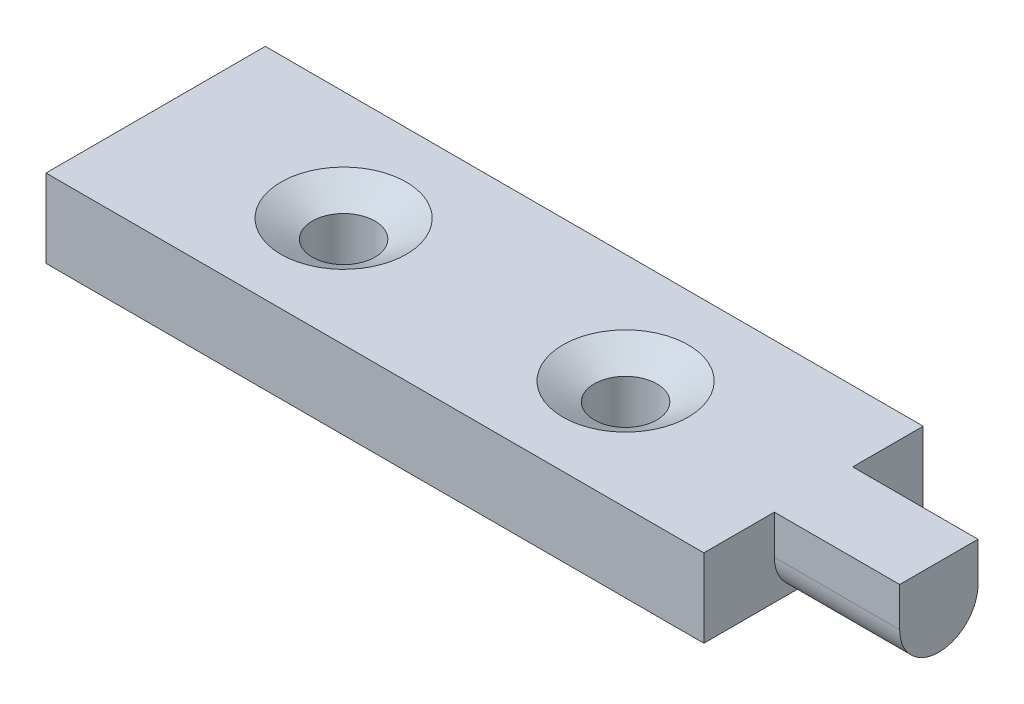
ISO-10303-21;
HEADER;
FILE_DESCRIPTION(('STEP AP214'),'2;1');
FILE_NAME('part.step','',(''),(''),'','','');
FILE_SCHEMA(('AUTOMOTIVE_DESIGN { 1 0 10303 214 1 1 1 1 }'));
ENDSEC;
DATA;
#1=APPLICATION_CONTEXT('core data for automotive mechanical design processes');
#2=APPLICATION_PROTOCOL_DEFINITION('international standard','automotive_design',2000,#1);
#3=PRODUCT_CONTEXT('',#1,'mechanical');
#4=PRODUCT('Part','Part','',(#3));
#5=PRODUCT_RELATED_PRODUCT_CATEGORY('part','',(#4));
#6=PRODUCT_DEFINITION_FORMATION('','',#4);
#7=PRODUCT_DEFINITION_CONTEXT('part definition',#1,'design');
#8=PRODUCT_DEFINITION('design','',#6,#7);
#9=PRODUCT_DEFINITION_SHAPE('','',#8);
#10=(LENGTH_UNIT() NAMED_UNIT(*) SI_UNIT(.MILLI.,.METRE.));
#11=(NAMED_UNIT(*) PLANE_ANGLE_UNIT() SI_UNIT($,.RADIAN.));
#12=(NAMED_UNIT(*) SI_UNIT($,.STERADIAN.) SOLID_ANGLE_UNIT());
#13=UNCERTAINTY_MEASURE_WITH_UNIT(LENGTH_MEASURE(1.E-05),#10,'distance_accuracy_value','');
#14=(GEOMETRIC_REPRESENTATION_CONTEXT(3) GLOBAL_UNCERTAINTY_ASSIGNED_CONTEXT((#13)) GLOBAL_UNIT_ASSIGNED_CONTEXT((#10,
#11,#12)) REPRESENTATION_CONTEXT('',''));
#15=CARTESIAN_POINT('',(0.,0.,0.));
#16=DIRECTION('',(0.,0.,1.));
#17=DIRECTION('',(1.,0.,0.));
#18=AXIS2_PLACEMENT_3D('',#15,#16,#17);
#19=CARTESIAN_POINT('',(0.,0.,0.));
#20=DIRECTION('',(0.,1.,0.));
#21=DIRECTION('',(0.,0.,1.));
#22=AXIS2_PLACEMENT_3D('',#19,#20,#21);
#23=PLANE('',#22);
#24=CARTESIAN_POINT('',(5.90163934426229,0.,-1.72131147540984));
#25=DIRECTION('',(0.,1.,0.));
#26=DIRECTION('',(0.,0.,1.));
#27=AXIS2_PLACEMENT_3D('',#24,#25,#26);
#28=CIRCLE('',#27,2.);
#29=CARTESIAN_POINT('',(5.90163934426229,0.,0.278688524590163));
#30=VERTEX_POINT('',#29);
#31=EDGE_CURVE('E108',#30,#30,#28,.T.);
#32=ORIENTED_EDGE('',*,*,#31,.T.);
#33=EDGE_LOOP('',(#32));
#34=FACE_BOUND('',#33,.T.);
#35=CARTESIAN_POINT('',(-12.0983606557377,0.,-1.72131147540984));
#36=DIRECTION('',(0.,1.,0.));
#37=DIRECTION('',(0.,0.,1.));
#38=AXIS2_PLACEMENT_3D('',#35,#36,#37);
#39=CIRCLE('',#38,2.);
#40=CARTESIAN_POINT('',(-12.0983606557377,0.,0.278688524590163));
#41=VERTEX_POINT('',#40);
#42=EDGE_CURVE('E114',#41,#41,#39,.T.);
#43=ORIENTED_EDGE('',*,*,#42,.T.);
#44=EDGE_LOOP('',(#43));
#45=FACE_BOUND('',#44,.T.);
#46=DIRECTION('',(0.,0.,-1.));
#47=VECTOR('',#46,1.);
#48=CARTESIAN_POINT('',(17.9016393442623,0.,0.));
#49=LINE('',#48,#47);
#50=CARTESIAN_POINT('',(17.9016393442623,0.,-1.72131147540984));
#51=VERTEX_POINT('',#50);
#52=CARTESIAN_POINT('',(17.9016393442623,0.,-8.72131147540984));
#53=VERTEX_POINT('',#52);
#54=EDGE_CURVE('E213',#51,#53,#49,.T.);
#55=ORIENTED_EDGE('',*,*,#54,.F.);
#56=DIRECTION('',(0.,0.,-1.));
#57=VECTOR('',#56,1.);
#58=CARTESIAN_POINT('',(17.9016393442623,0.,0.));
#59=LINE('',#58,#57);
#60=CARTESIAN_POINT('',(17.9016393442623,0.,5.27868852459016));
#61=VERTEX_POINT('',#60);
#62=EDGE_CURVE('E221',#61,#51,#59,.T.);
#63=ORIENTED_EDGE('',*,*,#62,.F.);
#64=DIRECTION('',(1.,0.,0.));
#65=VECTOR('',#64,1.);
#66=CARTESIAN_POINT('',(-24.0983606557377,0.,5.27868852459016));
#67=LINE('',#66,#65);
#68=CARTESIAN_POINT('',(-24.0983606557377,0.,5.27868852459016));
#69=VERTEX_POINT('',#68);
#70=EDGE_CURVE('E94',#69,#61,#67,.T.);
#71=ORIENTED_EDGE('',*,*,#70,.F.);
#72=DIRECTION('',(0.,0.,1.));
#73=VECTOR('',#72,1.);
#74=CARTESIAN_POINT('',(-24.0983606557377,0.,-8.72131147540984));
#75=LINE('',#74,#73);
#76=CARTESIAN_POINT('',(-24.0983606557377,0.,-8.72131147540984));
#77=VERTEX_POINT('',#76);
#78=EDGE_CURVE('E100',#77,#69,#75,.T.);
#79=ORIENTED_EDGE('',*,*,#78,.F.);
#80=DIRECTION('',(-1.,0.,0.));
#81=VECTOR('',#80,1.);
#82=CARTESIAN_POINT('',(-24.0983606557377,0.,-8.72131147540984));
#83=LINE('',#82,#81);
#84=EDGE_CURVE('E81',#53,#77,#83,.T.);
#85=ORIENTED_EDGE('',*,*,#84,.F.);
#86=EDGE_LOOP('',(#55,#63,#71,#79,#85));
#87=FACE_BOUND('',#86,.T.);
#88=ADVANCED_FACE('F41',(#34,#45,#87),#23,.F.);
#89=CARTESIAN_POINT('',(25.9016393442623,5.,-8.72131147540984));
#90=DIRECTION('',(-1.,0.,0.));
#91=DIRECTION('',(0.,0.,1.));
#92=AXIS2_PLACEMENT_3D('',#89,#90,#91);
#93=PLANE('',#92);
#94=CARTESIAN_POINT('',(25.9016393442623,2.5,-1.72131147540984));
#95=DIRECTION('',(1.,0.,0.));
#96=DIRECTION('',(0.,0.,-1.));
#97=AXIS2_PLACEMENT_3D('',#94,#95,#96);
#98=CIRCLE('',#97,2.5);
#99=CARTESIAN_POINT('',(25.9016393442623,2.5,0.778688524590163));
#100=VERTEX_POINT('',#99);
#101=CARTESIAN_POINT('',(25.9016393442623,2.5,-4.22131147540984));
#102=VERTEX_POINT('',#101);
#103=EDGE_CURVE('E58',#100,#102,#98,.T.);
#104=ORIENTED_EDGE('',*,*,#103,.T.);
#105=DIRECTION('',(0.,1.,0.));
#106=VECTOR('',#105,1.);
#107=CARTESIAN_POINT('',(25.9016393442623,0.,-4.22131147540984));
#108=LINE('',#107,#106);
#109=CARTESIAN_POINT('',(25.9016393442623,5.,-4.22131147540984));
#110=VERTEX_POINT('',#109);
#111=EDGE_CURVE('E186',#102,#110,#108,.T.);
#112=ORIENTED_EDGE('',*,*,#111,.T.);
#113=DIRECTION('',(0.,0.,-1.));
#114=VECTOR('',#113,1.);
#115=CARTESIAN_POINT('',(25.9016393442623,5.,-8.72131147540984));
#116=LINE('',#115,#114);
#117=CARTESIAN_POINT('',(25.9016393442623,5.,0.778688524590163));
#118=VERTEX_POINT('',#117);
#119=EDGE_CURVE('E164',#118,#110,#116,.T.);
#120=ORIENTED_EDGE('',*,*,#119,.F.);
#121=DIRECTION('',(0.,1.,0.));
#122=VECTOR('',#121,1.);
#123=CARTESIAN_POINT('',(25.9016393442623,0.,0.778688524590163));
#124=LINE('',#123,#122);
#125=EDGE_CURVE('E184',#100,#118,#124,.T.);
#126=ORIENTED_EDGE('',*,*,#125,.F.);
#127=EDGE_LOOP('',(#104,#112,#120,#126));
#128=FACE_BOUND('',#127,.T.);
#129=ADVANCED_FACE('F182',(#128),#93,.F.);
#130=CARTESIAN_POINT('',(0.,5.,0.));
#131=DIRECTION('',(0.,1.,0.));
#132=DIRECTION('',(0.,0.,1.));
#133=AXIS2_PLACEMENT_3D('',#130,#131,#132);
#134=PLANE('',#133);
#135=CARTESIAN_POINT('',(-12.0983606557377,5.,-1.72131147540984));
#136=DIRECTION('',(0.,1.,0.));
#137=DIRECTION('',(0.,0.,1.));
#138=AXIS2_PLACEMENT_3D('',#135,#136,#137);
#139=CIRCLE('',#138,4.00000000000001);
#140=CARTESIAN_POINT('',(-12.0983606557377,5.,2.27868852459017));
#141=VERTEX_POINT('',#140);
#142=EDGE_CURVE('E51',#141,#141,#139,.F.);
#143=ORIENTED_EDGE('',*,*,#142,.T.);
#144=EDGE_LOOP('',(#143));
#145=FACE_BOUND('',#144,.T.);
#146=CARTESIAN_POINT('',(5.90163934426229,5.,-1.72131147540984));
#147=DIRECTION('',(0.,1.,0.));
#148=DIRECTION('',(0.,0.,1.));
#149=AXIS2_PLACEMENT_3D('',#146,#147,#148);
#150=CIRCLE('',#149,4.00000000000001);
#151=CARTESIAN_POINT('',(5.90163934426229,5.,2.27868852459017));
#152=VERTEX_POINT('',#151);
#153=EDGE_CURVE('E125',#152,#152,#150,.F.);
#154=ORIENTED_EDGE('',*,*,#153,.T.);
#155=EDGE_LOOP('',(#154));
#156=FACE_BOUND('',#155,.T.);
#157=ORIENTED_EDGE('',*,*,#119,.T.);
#158=DIRECTION('',(1.,0.,0.));
#159=VECTOR('',#158,1.);
#160=CARTESIAN_POINT('',(17.9016393442623,5.,-4.22131147540984));
#161=LINE('',#160,#159);
#162=CARTESIAN_POINT('',(17.9016393442623,5.,-4.22131147540984));
#163=VERTEX_POINT('',#162);
#164=EDGE_CURVE('E173',#163,#110,#161,.T.);
#165=ORIENTED_EDGE('',*,*,#164,.F.);
#166=DIRECTION('',(0.,0.,1.));
#167=VECTOR('',#166,1.);
#168=CARTESIAN_POINT('',(17.9016393442623,5.,0.));
#169=LINE('',#168,#167);
#170=CARTESIAN_POINT('',(17.9016393442623,5.,-8.72131147540984));
#171=VERTEX_POINT('',#170);
#172=EDGE_CURVE('E254',#171,#163,#169,.T.);
#173=ORIENTED_EDGE('',*,*,#172,.F.);
#174=DIRECTION('',(-1.,0.,0.));
#175=VECTOR('',#174,1.);
#176=CARTESIAN_POINT('',(-24.0983606557377,5.,-8.72131147540984));
#177=LINE('',#176,#175);
#178=CARTESIAN_POINT('',(-24.0983606557377,5.,-8.72131147540984));
#179=VERTEX_POINT('',#178);
#180=EDGE_CURVE('E67',#171,#179,#177,.T.);
#181=ORIENTED_EDGE('',*,*,#180,.T.);
#182=DIRECTION('',(0.,0.,1.));
#183=VECTOR('',#182,1.);
#184=CARTESIAN_POINT('',(-24.0983606557377,5.,-8.72131147540984));
#185=LINE('',#184,#183);
#186=CARTESIAN_POINT('',(-24.0983606557377,5.,5.27868852459016));
#187=VERTEX_POINT('',#186);
#188=EDGE_CURVE('E93',#179,#187,#185,.T.);
#189=ORIENTED_EDGE('',*,*,#188,.T.);
#190=DIRECTION('',(1.,0.,0.));
#191=VECTOR('',#190,1.);
#192=CARTESIAN_POINT('',(-24.0983606557377,5.,5.27868852459016));
#193=LINE('',#192,#191);
#194=CARTESIAN_POINT('',(17.9016393442623,5.,5.27868852459016));
#195=VERTEX_POINT('',#194);
#196=EDGE_CURVE('E161',#187,#195,#193,.T.);
#197=ORIENTED_EDGE('',*,*,#196,.T.);
#198=DIRECTION('',(0.,0.,1.));
#199=VECTOR('',#198,1.);
#200=CARTESIAN_POINT('',(17.9016393442623,5.,0.));
#201=LINE('',#200,#199);
#202=CARTESIAN_POINT('',(17.9016393442623,5.,0.778688524590163));
#203=VERTEX_POINT('',#202);
#204=EDGE_CURVE('E239',#203,#195,#201,.T.);
#205=ORIENTED_EDGE('',*,*,#204,.F.);
#206=DIRECTION('',(1.,0.,0.));
#207=VECTOR('',#206,1.);
#208=CARTESIAN_POINT('',(17.9016393442623,5.,0.778688524590163));
#209=LINE('',#208,#207);
#210=EDGE_CURVE('E151',#203,#118,#209,.T.);
#211=ORIENTED_EDGE('',*,*,#210,.T.);
#212=EDGE_LOOP('',(#157,#165,#173,#181,#189,#197,#205,#211));
#213=FACE_BOUND('',#212,.T.);
#214=ADVANCED_FACE('F132',(#145,#156,#213),#134,.T.);
#215=CARTESIAN_POINT('',(-24.0983606557377,5.,-8.72131147540984));
#216=DIRECTION('',(0.,0.,1.));
#217=DIRECTION('',(1.,0.,0.));
#218=AXIS2_PLACEMENT_3D('',#215,#216,#217);
#219=PLANE('',#218);
#220=DIRECTION('',(0.,1.,0.));
#221=VECTOR('',#220,1.);
#222=CARTESIAN_POINT('',(17.9016393442623,0.,-8.72131147540984));
#223=LINE('',#222,#221);
#224=EDGE_CURVE('E88',#53,#171,#223,.T.);
#225=ORIENTED_EDGE('',*,*,#224,.F.);
#226=ORIENTED_EDGE('',*,*,#84,.T.);
#227=DIRECTION('',(0.,-1.,0.));
#228=VECTOR('',#227,1.);
#229=CARTESIAN_POINT('',(-24.0983606557377,5.,-8.72131147540984));
#230=LINE('',#229,#228);
#231=EDGE_CURVE('E84',#179,#77,#230,.T.);
#232=ORIENTED_EDGE('',*,*,#231,.F.);
#233=ORIENTED_EDGE('',*,*,#180,.F.);
#234=EDGE_LOOP('',(#225,#226,#232,#233));
#235=FACE_BOUND('',#234,.T.);
#236=ADVANCED_FACE('F83',(#235),#219,.F.);
#237=CARTESIAN_POINT('',(-24.0983606557377,5.,5.27868852459016));
#238=DIRECTION('',(0.,0.,-1.));
#239=DIRECTION('',(-1.,0.,0.));
#240=AXIS2_PLACEMENT_3D('',#237,#238,#239);
#241=PLANE('',#240);
#242=DIRECTION('',(0.,-1.,0.));
#243=VECTOR('',#242,1.);
#244=CARTESIAN_POINT('',(17.9016393442623,0.,5.27868852459016));
#245=LINE('',#244,#243);
#246=EDGE_CURVE('E234',#195,#61,#245,.T.);
#247=ORIENTED_EDGE('',*,*,#246,.F.);
#248=ORIENTED_EDGE('',*,*,#196,.F.);
#249=DIRECTION('',(0.,-1.,0.));
#250=VECTOR('',#249,1.);
#251=CARTESIAN_POINT('',(-24.0983606557377,5.,5.27868852459016));
#252=LINE('',#251,#250);
#253=EDGE_CURVE('E102',#187,#69,#252,.T.);
#254=ORIENTED_EDGE('',*,*,#253,.T.);
#255=ORIENTED_EDGE('',*,*,#70,.T.);
#256=EDGE_LOOP('',(#247,#248,#254,#255));
#257=FACE_BOUND('',#256,.T.);
#258=ADVANCED_FACE('F264',(#257),#241,.F.);
#259=CARTESIAN_POINT('',(-24.0983606557377,5.,-8.72131147540984));
#260=DIRECTION('',(1.,0.,0.));
#261=DIRECTION('',(0.,0.,-1.));
#262=AXIS2_PLACEMENT_3D('',#259,#260,#261);
#263=PLANE('',#262);
#264=ORIENTED_EDGE('',*,*,#78,.T.);
#265=ORIENTED_EDGE('',*,*,#253,.F.);
#266=ORIENTED_EDGE('',*,*,#188,.F.);
#267=ORIENTED_EDGE('',*,*,#231,.T.);
#268=EDGE_LOOP('',(#264,#265,#266,#267));
#269=FACE_BOUND('',#268,.T.);
#270=ADVANCED_FACE('F98',(#269),#263,.F.);
#271=CARTESIAN_POINT('',(5.90163934426229,5.,-1.72131147540984));
#272=DIRECTION('',(0.,-1.,0.));
#273=DIRECTION('',(0.,0.,-1.));
#274=AXIS2_PLACEMENT_3D('',#271,#272,#273);
#275=CYLINDRICAL_SURFACE('',#274,2.);
#276=CARTESIAN_POINT('',(5.90163934426229,3.84529946162075,-1.72131147540984));
#277=DIRECTION('',(0.,1.,0.));
#278=DIRECTION('',(0.,0.,1.));
#279=AXIS2_PLACEMENT_3D('',#276,#277,#278);
#280=CIRCLE('',#279,2.);
#281=CARTESIAN_POINT('',(5.90163934426229,3.84529946162075,0.278688524590163));
#282=VERTEX_POINT('',#281);
#283=EDGE_CURVE('E11',#282,#282,#280,.T.);
#284=ORIENTED_EDGE('',*,*,#283,.T.);
#285=EDGE_LOOP('',(#284));
#286=FACE_BOUND('',#285,.T.);
#287=ORIENTED_EDGE('',*,*,#31,.F.);
#288=EDGE_LOOP('',(#287));
#289=FACE_BOUND('',#288,.T.);
#290=ADVANCED_FACE('F145',(#286,#289),#275,.F.);
#291=CARTESIAN_POINT('',(-12.0983606557377,5.,-1.72131147540984));
#292=DIRECTION('',(0.,-1.,0.));
#293=DIRECTION('',(0.,0.,-1.));
#294=AXIS2_PLACEMENT_3D('',#291,#292,#293);
#295=CYLINDRICAL_SURFACE('',#294,2.);
#296=CARTESIAN_POINT('',(-12.0983606557377,3.84529946162075,-1.72131147540984));
#297=DIRECTION('',(0.,1.,0.));
#298=DIRECTION('',(0.,0.,1.));
#299=AXIS2_PLACEMENT_3D('',#296,#297,#298);
#300=CIRCLE('',#299,2.);
#301=CARTESIAN_POINT('',(-12.0983606557377,3.84529946162075,0.278688524590163));
#302=VERTEX_POINT('',#301);
#303=EDGE_CURVE('E121',#302,#302,#300,.T.);
#304=ORIENTED_EDGE('',*,*,#303,.T.);
#305=EDGE_LOOP('',(#304));
#306=FACE_BOUND('',#305,.T.);
#307=ORIENTED_EDGE('',*,*,#42,.F.);
#308=EDGE_LOOP('',(#307));
#309=FACE_BOUND('',#308,.T.);
#310=ADVANCED_FACE('F141',(#306,#309),#295,.F.);
#311=CARTESIAN_POINT('',(17.9016393442623,2.5,-1.72131147540984));
#312=DIRECTION('',(1.,0.,0.));
#313=DIRECTION('',(0.,0.,-1.));
#314=AXIS2_PLACEMENT_3D('',#311,#312,#313);
#315=CYLINDRICAL_SURFACE('',#314,2.5);
#316=ORIENTED_EDGE('',*,*,#103,.F.);
#317=DIRECTION('',(1.,0.,0.));
#318=VECTOR('',#317,1.);
#319=CARTESIAN_POINT('',(17.9016393442623,2.5,0.778688524590163));
#320=LINE('',#319,#318);
#321=CARTESIAN_POINT('',(17.9016393442623,2.5,0.778688524590163));
#322=VERTEX_POINT('',#321);
#323=EDGE_CURVE('E155',#322,#100,#320,.T.);
#324=ORIENTED_EDGE('',*,*,#323,.F.);
#325=CARTESIAN_POINT('',(17.9016393442623,2.5,-1.72131147540984));
#326=DIRECTION('',(1.,0.,0.));
#327=DIRECTION('',(0.,0.,-1.));
#328=AXIS2_PLACEMENT_3D('',#325,#326,#327);
#329=CIRCLE('',#328,2.5);
#330=EDGE_CURVE('E225',#322,#51,#329,.T.);
#331=ORIENTED_EDGE('',*,*,#330,.T.);
#332=CARTESIAN_POINT('',(17.9016393442623,2.5,-1.72131147540984));
#333=DIRECTION('',(1.,0.,0.));
#334=DIRECTION('',(0.,0.,-1.));
#335=AXIS2_PLACEMENT_3D('',#332,#333,#334);
#336=CIRCLE('',#335,2.5);
#337=CARTESIAN_POINT('',(17.9016393442623,2.5,-4.22131147540984));
#338=VERTEX_POINT('',#337);
#339=EDGE_CURVE('E212',#51,#338,#336,.T.);
#340=ORIENTED_EDGE('',*,*,#339,.T.);
#341=DIRECTION('',(1.,0.,0.));
#342=VECTOR('',#341,1.);
#343=CARTESIAN_POINT('',(17.9016393442623,2.5,-4.22131147540984));
#344=LINE('',#343,#342);
#345=EDGE_CURVE('E245',#338,#102,#344,.T.);
#346=ORIENTED_EDGE('',*,*,#345,.T.);
#347=EDGE_LOOP('',(#316,#324,#331,#340,#346));
#348=FACE_BOUND('',#347,.T.);
#349=ADVANCED_FACE('F144',(#348),#315,.T.);
#350=CARTESIAN_POINT('',(17.9016393442623,0.,0.778688524590163));
#351=DIRECTION('',(0.,0.,-1.));
#352=DIRECTION('',(-1.,0.,0.));
#353=AXIS2_PLACEMENT_3D('',#350,#351,#352);
#354=PLANE('',#353);
#355=ORIENTED_EDGE('',*,*,#125,.T.);
#356=ORIENTED_EDGE('',*,*,#210,.F.);
#357=DIRECTION('',(0.,1.,0.));
#358=VECTOR('',#357,1.);
#359=CARTESIAN_POINT('',(17.9016393442623,0.,0.778688524590163));
#360=LINE('',#359,#358);
#361=EDGE_CURVE('E230',#322,#203,#360,.T.);
#362=ORIENTED_EDGE('',*,*,#361,.F.);
#363=ORIENTED_EDGE('',*,*,#323,.T.);
#364=EDGE_LOOP('',(#355,#356,#362,#363));
#365=FACE_BOUND('',#364,.T.);
#366=ADVANCED_FACE('F288',(#365),#354,.F.);
#367=CARTESIAN_POINT('',(17.9016393442623,0.,0.));
#368=DIRECTION('',(1.,0.,0.));
#369=DIRECTION('',(0.,0.,-1.));
#370=AXIS2_PLACEMENT_3D('',#367,#368,#369);
#371=PLANE('',#370);
#372=ORIENTED_EDGE('',*,*,#330,.F.);
#373=ORIENTED_EDGE('',*,*,#361,.T.);
#374=ORIENTED_EDGE('',*,*,#204,.T.);
#375=ORIENTED_EDGE('',*,*,#246,.T.);
#376=ORIENTED_EDGE('',*,*,#62,.T.);
#377=EDGE_LOOP('',(#372,#373,#374,#375,#376));
#378=FACE_BOUND('',#377,.T.);
#379=ADVANCED_FACE('F232',(#378),#371,.T.);
#380=CARTESIAN_POINT('',(17.9016393442623,0.,-4.22131147540984));
#381=DIRECTION('',(0.,0.,-1.));
#382=DIRECTION('',(-1.,0.,0.));
#383=AXIS2_PLACEMENT_3D('',#380,#381,#382);
#384=PLANE('',#383);
#385=ORIENTED_EDGE('',*,*,#111,.F.);
#386=ORIENTED_EDGE('',*,*,#345,.F.);
#387=DIRECTION('',(0.,1.,0.));
#388=VECTOR('',#387,1.);
#389=CARTESIAN_POINT('',(17.9016393442623,0.,-4.22131147540984));
#390=LINE('',#389,#388);
#391=EDGE_CURVE('E215',#338,#163,#390,.T.);
#392=ORIENTED_EDGE('',*,*,#391,.T.);
#393=ORIENTED_EDGE('',*,*,#164,.T.);
#394=EDGE_LOOP('',(#385,#386,#392,#393));
#395=FACE_BOUND('',#394,.T.);
#396=ADVANCED_FACE('F293',(#395),#384,.T.);
#397=CARTESIAN_POINT('',(17.9016393442623,0.,0.));
#398=DIRECTION('',(1.,0.,0.));
#399=DIRECTION('',(0.,0.,-1.));
#400=AXIS2_PLACEMENT_3D('',#397,#398,#399);
#401=PLANE('',#400);
#402=ORIENTED_EDGE('',*,*,#339,.F.);
#403=ORIENTED_EDGE('',*,*,#54,.T.);
#404=ORIENTED_EDGE('',*,*,#224,.T.);
#405=ORIENTED_EDGE('',*,*,#172,.T.);
#406=ORIENTED_EDGE('',*,*,#391,.F.);
#407=EDGE_LOOP('',(#402,#403,#404,#405,#406));
#408=FACE_BOUND('',#407,.T.);
#409=ADVANCED_FACE('F138',(#408),#401,.T.);
#410=CARTESIAN_POINT('',(-12.0983606557377,3.84529946162075,-1.72131147540984));
#411=DIRECTION('',(0.,1.,0.));
#412=DIRECTION('',(0.,0.,1.));
#413=AXIS2_PLACEMENT_3D('',#410,#411,#412);
#414=CONICAL_SURFACE('',#413,2.,1.0471975511966);
#415=ORIENTED_EDGE('',*,*,#142,.F.);
#416=EDGE_LOOP('',(#415));
#417=FACE_BOUND('',#416,.T.);
#418=ORIENTED_EDGE('',*,*,#303,.F.);
#419=EDGE_LOOP('',(#418));
#420=FACE_BOUND('',#419,.T.);
#421=ADVANCED_FACE('F135',(#417,#420),#414,.F.);
#422=CARTESIAN_POINT('',(5.90163934426229,3.84529946162075,-1.72131147540984));
#423=DIRECTION('',(0.,1.,0.));
#424=DIRECTION('',(0.,0.,1.));
#425=AXIS2_PLACEMENT_3D('',#422,#423,#424);
#426=CONICAL_SURFACE('',#425,2.,1.0471975511966);
#427=ORIENTED_EDGE('',*,*,#153,.F.);
#428=EDGE_LOOP('',(#427));
#429=FACE_BOUND('',#428,.T.);
#430=ORIENTED_EDGE('',*,*,#283,.F.);
#431=EDGE_LOOP('',(#430));
#432=FACE_BOUND('',#431,.T.);
#433=ADVANCED_FACE('F44',(#429,#432),#426,.F.);
#434=CLOSED_SHELL('',(#88,#129,#214,#236,#258,#270,#290,#310,#349,#366,#379,#396,#409,#421,#433));
#435=MANIFOLD_SOLID_BREP('B2',#434);
#436=ADVANCED_BREP_SHAPE_REPRESENTATION('',(#18,#435),#14);
#437=SHAPE_DEFINITION_REPRESENTATION(#9,#436);
ENDSEC;
END-ISO-10303-21;
